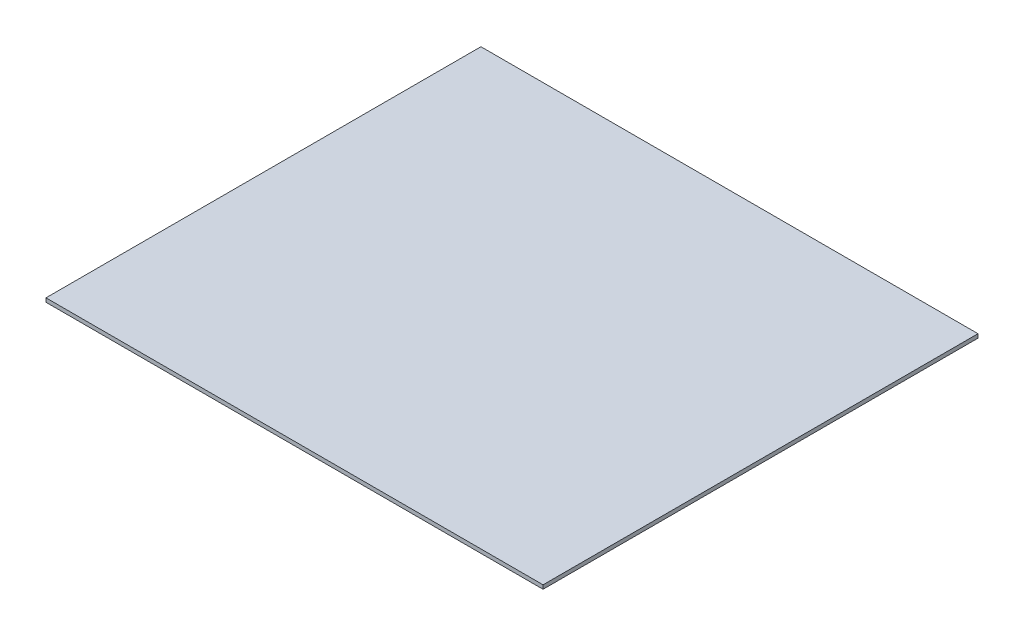
ISO-10303-21;
HEADER;
FILE_DESCRIPTION(('STEP AP214'),'2;1');
FILE_NAME('part.step','',(''),(''),'','','');
FILE_SCHEMA(('AUTOMOTIVE_DESIGN { 1 0 10303 214 1 1 1 1 }'));
ENDSEC;
DATA;
#1=APPLICATION_CONTEXT('core data for automotive mechanical design processes');
#2=APPLICATION_PROTOCOL_DEFINITION('international standard','automotive_design',2000,#1);
#3=PRODUCT_CONTEXT('',#1,'mechanical');
#4=PRODUCT('Part','Part','',(#3));
#5=PRODUCT_RELATED_PRODUCT_CATEGORY('part','',(#4));
#6=PRODUCT_DEFINITION_FORMATION('','',#4);
#7=PRODUCT_DEFINITION_CONTEXT('part definition',#1,'design');
#8=PRODUCT_DEFINITION('design','',#6,#7);
#9=PRODUCT_DEFINITION_SHAPE('','',#8);
#10=(LENGTH_UNIT() NAMED_UNIT(*) SI_UNIT(.MILLI.,.METRE.));
#11=(NAMED_UNIT(*) PLANE_ANGLE_UNIT() SI_UNIT($,.RADIAN.));
#12=(NAMED_UNIT(*) SI_UNIT($,.STERADIAN.) SOLID_ANGLE_UNIT());
#13=UNCERTAINTY_MEASURE_WITH_UNIT(LENGTH_MEASURE(1.E-05),#10,'distance_accuracy_value','');
#14=(GEOMETRIC_REPRESENTATION_CONTEXT(3) GLOBAL_UNCERTAINTY_ASSIGNED_CONTEXT((#13)) GLOBAL_UNIT_ASSIGNED_CONTEXT((#10,
#11,#12)) REPRESENTATION_CONTEXT('',''));
#15=CARTESIAN_POINT('',(0.,0.,0.));
#16=DIRECTION('',(0.,0.,1.));
#17=DIRECTION('',(1.,0.,0.));
#18=AXIS2_PLACEMENT_3D('',#15,#16,#17);
#19=CARTESIAN_POINT('',(-101.6,-1.5875,-88.9));
#20=DIRECTION('',(-1.,0.,0.));
#21=DIRECTION('',(0.,0.,1.));
#22=AXIS2_PLACEMENT_3D('',#19,#20,#21);
#23=PLANE('',#22);
#24=DIRECTION('',(0.,0.,1.));
#25=VECTOR('',#24,1.);
#26=CARTESIAN_POINT('',(-101.6,0.,-88.9));
#27=LINE('',#26,#25);
#28=CARTESIAN_POINT('',(-101.6,0.,-88.9));
#29=VERTEX_POINT('',#28);
#30=CARTESIAN_POINT('',(-101.6,0.,88.9));
#31=VERTEX_POINT('',#30);
#32=EDGE_CURVE('E99',#29,#31,#27,.T.);
#33=ORIENTED_EDGE('',*,*,#32,.F.);
#34=DIRECTION('',(0.,1.,0.));
#35=VECTOR('',#34,1.);
#36=CARTESIAN_POINT('',(-101.6,-1.5875,-88.9));
#37=LINE('',#36,#35);
#38=CARTESIAN_POINT('',(-101.6,-1.5875,-88.9));
#39=VERTEX_POINT('',#38);
#40=EDGE_CURVE('E11',#39,#29,#37,.T.);
#41=ORIENTED_EDGE('',*,*,#40,.F.);
#42=DIRECTION('',(0.,0.,1.));
#43=VECTOR('',#42,1.);
#44=CARTESIAN_POINT('',(-101.6,-1.5875,-88.9));
#45=LINE('',#44,#43);
#46=CARTESIAN_POINT('',(-101.6,-1.5875,88.9));
#47=VERTEX_POINT('',#46);
#48=EDGE_CURVE('E93',#39,#47,#45,.T.);
#49=ORIENTED_EDGE('',*,*,#48,.T.);
#50=DIRECTION('',(0.,1.,0.));
#51=VECTOR('',#50,1.);
#52=CARTESIAN_POINT('',(-101.6,-1.5875,88.9));
#53=LINE('',#52,#51);
#54=EDGE_CURVE('E38',#47,#31,#53,.T.);
#55=ORIENTED_EDGE('',*,*,#54,.T.);
#56=EDGE_LOOP('',(#33,#41,#49,#55));
#57=FACE_BOUND('',#56,.T.);
#58=ADVANCED_FACE('F35',(#57),#23,.T.);
#59=CARTESIAN_POINT('',(-101.6,-1.5875,-88.9));
#60=DIRECTION('',(0.,0.,-1.));
#61=DIRECTION('',(-1.,0.,0.));
#62=AXIS2_PLACEMENT_3D('',#59,#60,#61);
#63=PLANE('',#62);
#64=DIRECTION('',(-1.,0.,0.));
#65=VECTOR('',#64,1.);
#66=CARTESIAN_POINT('',(-101.6,0.,-88.9));
#67=LINE('',#66,#65);
#68=CARTESIAN_POINT('',(101.6,0.,-88.9));
#69=VERTEX_POINT('',#68);
#70=EDGE_CURVE('E95',#69,#29,#67,.T.);
#71=ORIENTED_EDGE('',*,*,#70,.F.);
#72=DIRECTION('',(0.,1.,0.));
#73=VECTOR('',#72,1.);
#74=CARTESIAN_POINT('',(101.6,-1.5875,-88.9));
#75=LINE('',#74,#73);
#76=CARTESIAN_POINT('',(101.6,-1.5875,-88.9));
#77=VERTEX_POINT('',#76);
#78=EDGE_CURVE('E44',#77,#69,#75,.T.);
#79=ORIENTED_EDGE('',*,*,#78,.F.);
#80=DIRECTION('',(-1.,0.,0.));
#81=VECTOR('',#80,1.);
#82=CARTESIAN_POINT('',(-101.6,-1.5875,-88.9));
#83=LINE('',#82,#81);
#84=EDGE_CURVE('E90',#77,#39,#83,.T.);
#85=ORIENTED_EDGE('',*,*,#84,.T.);
#86=ORIENTED_EDGE('',*,*,#40,.T.);
#87=EDGE_LOOP('',(#71,#79,#85,#86));
#88=FACE_BOUND('',#87,.T.);
#89=ADVANCED_FACE('F109',(#88),#63,.T.);
#90=CARTESIAN_POINT('',(101.6,-1.5875,-88.9));
#91=DIRECTION('',(1.,0.,0.));
#92=DIRECTION('',(0.,0.,-1.));
#93=AXIS2_PLACEMENT_3D('',#90,#91,#92);
#94=PLANE('',#93);
#95=DIRECTION('',(0.,0.,-1.));
#96=VECTOR('',#95,1.);
#97=CARTESIAN_POINT('',(101.6,0.,-88.9));
#98=LINE('',#97,#96);
#99=CARTESIAN_POINT('',(101.6,0.,88.9));
#100=VERTEX_POINT('',#99);
#101=EDGE_CURVE('E85',#100,#69,#98,.T.);
#102=ORIENTED_EDGE('',*,*,#101,.F.);
#103=DIRECTION('',(0.,1.,0.));
#104=VECTOR('',#103,1.);
#105=CARTESIAN_POINT('',(101.6,-1.5875,88.9));
#106=LINE('',#105,#104);
#107=CARTESIAN_POINT('',(101.6,-1.5875,88.9));
#108=VERTEX_POINT('',#107);
#109=EDGE_CURVE('E80',#108,#100,#106,.T.);
#110=ORIENTED_EDGE('',*,*,#109,.F.);
#111=DIRECTION('',(0.,0.,-1.));
#112=VECTOR('',#111,1.);
#113=CARTESIAN_POINT('',(101.6,-1.5875,-88.9));
#114=LINE('',#113,#112);
#115=EDGE_CURVE('E83',#108,#77,#114,.T.);
#116=ORIENTED_EDGE('',*,*,#115,.T.);
#117=ORIENTED_EDGE('',*,*,#78,.T.);
#118=EDGE_LOOP('',(#102,#110,#116,#117));
#119=FACE_BOUND('',#118,.T.);
#120=ADVANCED_FACE('F82',(#119),#94,.T.);
#121=CARTESIAN_POINT('',(-101.6,-1.5875,88.9));
#122=DIRECTION('',(0.,0.,1.));
#123=DIRECTION('',(1.,0.,0.));
#124=AXIS2_PLACEMENT_3D('',#121,#122,#123);
#125=PLANE('',#124);
#126=DIRECTION('',(1.,0.,0.));
#127=VECTOR('',#126,1.);
#128=CARTESIAN_POINT('',(-101.6,0.,88.9));
#129=LINE('',#128,#127);
#130=EDGE_CURVE('E102',#31,#100,#129,.T.);
#131=ORIENTED_EDGE('',*,*,#130,.F.);
#132=ORIENTED_EDGE('',*,*,#54,.F.);
#133=DIRECTION('',(1.,0.,0.));
#134=VECTOR('',#133,1.);
#135=CARTESIAN_POINT('',(-101.6,-1.5875,88.9));
#136=LINE('',#135,#134);
#137=EDGE_CURVE('E89',#47,#108,#136,.T.);
#138=ORIENTED_EDGE('',*,*,#137,.T.);
#139=ORIENTED_EDGE('',*,*,#109,.T.);
#140=EDGE_LOOP('',(#131,#132,#138,#139));
#141=FACE_BOUND('',#140,.T.);
#142=ADVANCED_FACE('F92',(#141),#125,.T.);
#143=CARTESIAN_POINT('',(0.,-1.5875,0.));
#144=DIRECTION('',(0.,1.,0.));
#145=DIRECTION('',(0.,0.,1.));
#146=AXIS2_PLACEMENT_3D('',#143,#144,#145);
#147=PLANE('',#146);
#148=ORIENTED_EDGE('',*,*,#48,.F.);
#149=ORIENTED_EDGE('',*,*,#84,.F.);
#150=ORIENTED_EDGE('',*,*,#115,.F.);
#151=ORIENTED_EDGE('',*,*,#137,.F.);
#152=EDGE_LOOP('',(#148,#149,#150,#151));
#153=FACE_BOUND('',#152,.T.);
#154=ADVANCED_FACE('F88',(#153),#147,.F.);
#155=CARTESIAN_POINT('',(0.,0.,0.));
#156=DIRECTION('',(0.,1.,0.));
#157=DIRECTION('',(0.,0.,1.));
#158=AXIS2_PLACEMENT_3D('',#155,#156,#157);
#159=PLANE('',#158);
#160=ORIENTED_EDGE('',*,*,#32,.T.);
#161=ORIENTED_EDGE('',*,*,#130,.T.);
#162=ORIENTED_EDGE('',*,*,#101,.T.);
#163=ORIENTED_EDGE('',*,*,#70,.T.);
#164=EDGE_LOOP('',(#160,#161,#162,#163));
#165=FACE_BOUND('',#164,.T.);
#166=ADVANCED_FACE('F108',(#165),#159,.T.);
#167=CLOSED_SHELL('',(#58,#89,#120,#142,#154,#166));
#168=MANIFOLD_SOLID_BREP('B2',#167);
#169=ADVANCED_BREP_SHAPE_REPRESENTATION('',(#18,#168),#14);
#170=SHAPE_DEFINITION_REPRESENTATION(#9,#169);
ENDSEC;
END-ISO-10303-21;
